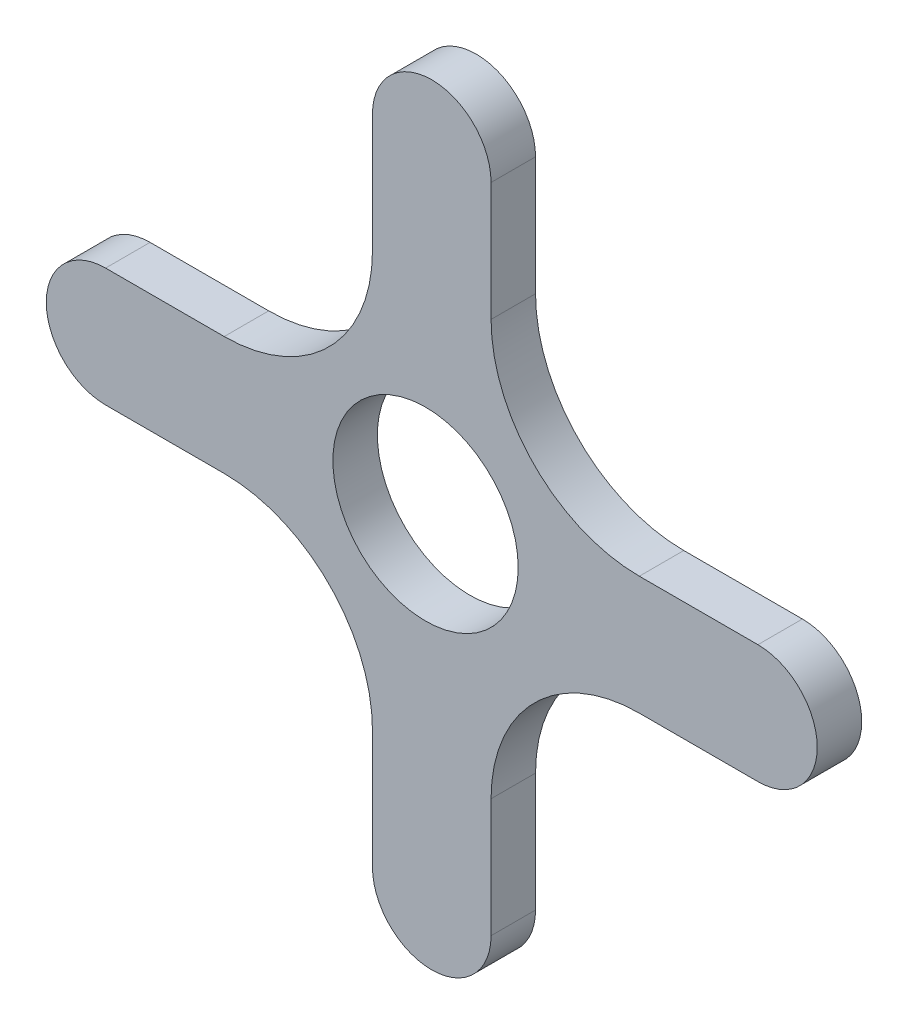
ISO-10303-21;
HEADER;
FILE_DESCRIPTION(('STEP AP214'),'2;1');
FILE_NAME('part.step','',(''),(''),'','','');
FILE_SCHEMA(('AUTOMOTIVE_DESIGN { 1 0 10303 214 1 1 1 1 }'));
ENDSEC;
DATA;
#1=APPLICATION_CONTEXT('core data for automotive mechanical design processes');
#2=APPLICATION_PROTOCOL_DEFINITION('international standard','automotive_design',2000,#1);
#3=PRODUCT_CONTEXT('',#1,'mechanical');
#4=PRODUCT('Part','Part','',(#3));
#5=PRODUCT_RELATED_PRODUCT_CATEGORY('part','',(#4));
#6=PRODUCT_DEFINITION_FORMATION('','',#4);
#7=PRODUCT_DEFINITION_CONTEXT('part definition',#1,'design');
#8=PRODUCT_DEFINITION('design','',#6,#7);
#9=PRODUCT_DEFINITION_SHAPE('','',#8);
#10=(LENGTH_UNIT() NAMED_UNIT(*) SI_UNIT(.MILLI.,.METRE.));
#11=(NAMED_UNIT(*) PLANE_ANGLE_UNIT() SI_UNIT($,.RADIAN.));
#12=(NAMED_UNIT(*) SI_UNIT($,.STERADIAN.) SOLID_ANGLE_UNIT());
#13=UNCERTAINTY_MEASURE_WITH_UNIT(LENGTH_MEASURE(1.E-05),#10,'distance_accuracy_value','');
#14=(GEOMETRIC_REPRESENTATION_CONTEXT(3) GLOBAL_UNCERTAINTY_ASSIGNED_CONTEXT((#13)) GLOBAL_UNIT_ASSIGNED_CONTEXT((#10,
#11,#12)) REPRESENTATION_CONTEXT('',''));
#15=CARTESIAN_POINT('',(0.,0.,0.));
#16=DIRECTION('',(0.,0.,1.));
#17=DIRECTION('',(1.,0.,0.));
#18=AXIS2_PLACEMENT_3D('',#15,#16,#17);
#19=CARTESIAN_POINT('',(-3.58058261758408,0.,3.));
#20=DIRECTION('',(-1.,0.,0.));
#21=DIRECTION('',(0.,-1.,0.));
#22=AXIS2_PLACEMENT_3D('',#19,#20,#21);
#23=PLANE('',#22);
#24=DIRECTION('',(0.,1.,0.));
#25=VECTOR('',#24,1.);
#26=CARTESIAN_POINT('',(-3.58058261758408,0.,0.));
#27=LINE('',#26,#25);
#28=CARTESIAN_POINT('',(-3.58058261758408,-22.4194173824159,0.));
#29=VERTEX_POINT('',#28);
#30=CARTESIAN_POINT('',(-3.58058261758408,-14.4194173824159,0.));
#31=VERTEX_POINT('',#30);
#32=EDGE_CURVE('E219',#29,#31,#27,.T.);
#33=ORIENTED_EDGE('',*,*,#32,.F.);
#34=DIRECTION('',(0.,0.,-1.));
#35=VECTOR('',#34,1.);
#36=CARTESIAN_POINT('',(-3.58058261758408,-22.4194173824159,3.));
#37=LINE('',#36,#35);
#38=CARTESIAN_POINT('',(-3.58058261758408,-22.4194173824159,3.));
#39=VERTEX_POINT('',#38);
#40=EDGE_CURVE('E11',#39,#29,#37,.T.);
#41=ORIENTED_EDGE('',*,*,#40,.F.);
#42=DIRECTION('',(0.,1.,0.));
#43=VECTOR('',#42,1.);
#44=CARTESIAN_POINT('',(-3.58058261758408,0.,3.));
#45=LINE('',#44,#43);
#46=CARTESIAN_POINT('',(-3.58058261758408,-14.4194173824159,3.));
#47=VERTEX_POINT('',#46);
#48=EDGE_CURVE('E334',#39,#47,#45,.T.);
#49=ORIENTED_EDGE('',*,*,#48,.T.);
#50=DIRECTION('',(0.,0.,-1.));
#51=VECTOR('',#50,1.);
#52=CARTESIAN_POINT('',(-3.58058261758408,-14.4194173824159,3.));
#53=LINE('',#52,#51);
#54=EDGE_CURVE('E110',#47,#31,#53,.T.);
#55=ORIENTED_EDGE('',*,*,#54,.T.);
#56=EDGE_LOOP('',(#33,#41,#49,#55));
#57=FACE_BOUND('',#56,.T.);
#58=ADVANCED_FACE('F35',(#57),#23,.T.);
#59=CARTESIAN_POINT('',(0.419417382415922,-22.4194173824159,3.));
#60=DIRECTION('',(0.,0.,-1.));
#61=DIRECTION('',(-1.,0.,0.));
#62=AXIS2_PLACEMENT_3D('',#59,#60,#61);
#63=CYLINDRICAL_SURFACE('',#62,4.);
#64=CARTESIAN_POINT('',(0.419417382415922,-22.4194173824159,0.));
#65=DIRECTION('',(0.,0.,1.));
#66=DIRECTION('',(1.,0.,0.));
#67=AXIS2_PLACEMENT_3D('',#64,#65,#66);
#68=CIRCLE('',#67,4.);
#69=CARTESIAN_POINT('',(4.41941738241592,-22.4194173824159,0.));
#70=VERTEX_POINT('',#69);
#71=EDGE_CURVE('E217',#29,#70,#68,.T.);
#72=ORIENTED_EDGE('',*,*,#71,.T.);
#73=DIRECTION('',(0.,0.,-1.));
#74=VECTOR('',#73,1.);
#75=CARTESIAN_POINT('',(4.41941738241592,-22.4194173824159,3.));
#76=LINE('',#75,#74);
#77=CARTESIAN_POINT('',(4.41941738241592,-22.4194173824159,3.));
#78=VERTEX_POINT('',#77);
#79=EDGE_CURVE('E44',#78,#70,#76,.T.);
#80=ORIENTED_EDGE('',*,*,#79,.F.);
#81=CARTESIAN_POINT('',(0.419417382415922,-22.4194173824159,3.));
#82=DIRECTION('',(0.,0.,1.));
#83=DIRECTION('',(1.,0.,0.));
#84=AXIS2_PLACEMENT_3D('',#81,#82,#83);
#85=CIRCLE('',#84,4.);
#86=EDGE_CURVE('E336',#39,#78,#85,.T.);
#87=ORIENTED_EDGE('',*,*,#86,.F.);
#88=ORIENTED_EDGE('',*,*,#40,.T.);
#89=EDGE_LOOP('',(#72,#80,#87,#88));
#90=FACE_BOUND('',#89,.T.);
#91=ADVANCED_FACE('F218',(#90),#63,.T.);
#92=CARTESIAN_POINT('',(4.41941738241592,0.,3.));
#93=DIRECTION('',(-1.,0.,0.));
#94=DIRECTION('',(0.,0.,1.));
#95=AXIS2_PLACEMENT_3D('',#92,#93,#94);
#96=PLANE('',#95);
#97=DIRECTION('',(0.,1.,0.));
#98=VECTOR('',#97,1.);
#99=CARTESIAN_POINT('',(4.41941738241592,0.,0.));
#100=LINE('',#99,#98);
#101=CARTESIAN_POINT('',(4.41941738241592,-14.4194173824159,0.));
#102=VERTEX_POINT('',#101);
#103=EDGE_CURVE('E211',#70,#102,#100,.T.);
#104=ORIENTED_EDGE('',*,*,#103,.T.);
#105=DIRECTION('',(0.,0.,-1.));
#106=VECTOR('',#105,1.);
#107=CARTESIAN_POINT('',(4.41941738241592,-14.4194173824159,3.));
#108=LINE('',#107,#106);
#109=CARTESIAN_POINT('',(4.41941738241592,-14.4194173824159,3.));
#110=VERTEX_POINT('',#109);
#111=EDGE_CURVE('E202',#110,#102,#108,.T.);
#112=ORIENTED_EDGE('',*,*,#111,.F.);
#113=DIRECTION('',(0.,1.,0.));
#114=VECTOR('',#113,1.);
#115=CARTESIAN_POINT('',(4.41941738241592,0.,3.));
#116=LINE('',#115,#114);
#117=EDGE_CURVE('E213',#78,#110,#116,.T.);
#118=ORIENTED_EDGE('',*,*,#117,.F.);
#119=ORIENTED_EDGE('',*,*,#79,.T.);
#120=EDGE_LOOP('',(#104,#112,#118,#119));
#121=FACE_BOUND('',#120,.T.);
#122=ADVANCED_FACE('F209',(#121),#96,.F.);
#123=CARTESIAN_POINT('',(14.4194173824159,-14.4194173824159,3.));
#124=DIRECTION('',(0.,0.,-1.));
#125=DIRECTION('',(-1.,0.,0.));
#126=AXIS2_PLACEMENT_3D('',#123,#124,#125);
#127=CYLINDRICAL_SURFACE('',#126,10.);
#128=CARTESIAN_POINT('',(14.4194173824159,-14.4194173824159,0.));
#129=DIRECTION('',(0.,0.,1.));
#130=DIRECTION('',(1.,0.,0.));
#131=AXIS2_PLACEMENT_3D('',#128,#129,#130);
#132=CIRCLE('',#131,10.);
#133=CARTESIAN_POINT('',(14.4194173824159,-4.41941738241592,0.));
#134=VERTEX_POINT('',#133);
#135=EDGE_CURVE('E221',#102,#134,#132,.F.);
#136=ORIENTED_EDGE('',*,*,#135,.T.);
#137=DIRECTION('',(0.,0.,-1.));
#138=VECTOR('',#137,1.);
#139=CARTESIAN_POINT('',(14.4194173824159,-4.41941738241592,3.));
#140=LINE('',#139,#138);
#141=CARTESIAN_POINT('',(14.4194173824159,-4.41941738241592,3.));
#142=VERTEX_POINT('',#141);
#143=EDGE_CURVE('E199',#142,#134,#140,.T.);
#144=ORIENTED_EDGE('',*,*,#143,.F.);
#145=CARTESIAN_POINT('',(14.4194173824159,-14.4194173824159,3.));
#146=DIRECTION('',(0.,0.,1.));
#147=DIRECTION('',(1.,0.,0.));
#148=AXIS2_PLACEMENT_3D('',#145,#146,#147);
#149=CIRCLE('',#148,10.);
#150=EDGE_CURVE('E341',#110,#142,#149,.F.);
#151=ORIENTED_EDGE('',*,*,#150,.F.);
#152=ORIENTED_EDGE('',*,*,#111,.T.);
#153=EDGE_LOOP('',(#136,#144,#151,#152));
#154=FACE_BOUND('',#153,.T.);
#155=ADVANCED_FACE('F285',(#154),#127,.F.);
#156=CARTESIAN_POINT('',(0.,-4.41941738241592,3.));
#157=DIRECTION('',(0.,1.,0.));
#158=DIRECTION('',(0.,0.,1.));
#159=AXIS2_PLACEMENT_3D('',#156,#157,#158);
#160=PLANE('',#159);
#161=DIRECTION('',(1.,0.,0.));
#162=VECTOR('',#161,1.);
#163=CARTESIAN_POINT('',(0.,-4.41941738241592,0.));
#164=LINE('',#163,#162);
#165=CARTESIAN_POINT('',(22.4194173824159,-4.41941738241592,0.));
#166=VERTEX_POINT('',#165);
#167=EDGE_CURVE('E229',#134,#166,#164,.T.);
#168=ORIENTED_EDGE('',*,*,#167,.T.);
#169=DIRECTION('',(0.,0.,-1.));
#170=VECTOR('',#169,1.);
#171=CARTESIAN_POINT('',(22.4194173824159,-4.41941738241592,3.));
#172=LINE('',#171,#170);
#173=CARTESIAN_POINT('',(22.4194173824159,-4.41941738241592,3.));
#174=VERTEX_POINT('',#173);
#175=EDGE_CURVE('E196',#174,#166,#172,.T.);
#176=ORIENTED_EDGE('',*,*,#175,.F.);
#177=DIRECTION('',(1.,0.,0.));
#178=VECTOR('',#177,1.);
#179=CARTESIAN_POINT('',(0.,-4.41941738241592,3.));
#180=LINE('',#179,#178);
#181=EDGE_CURVE('E344',#142,#174,#180,.T.);
#182=ORIENTED_EDGE('',*,*,#181,.F.);
#183=ORIENTED_EDGE('',*,*,#143,.T.);
#184=EDGE_LOOP('',(#168,#176,#182,#183));
#185=FACE_BOUND('',#184,.T.);
#186=ADVANCED_FACE('F288',(#185),#160,.F.);
#187=CARTESIAN_POINT('',(22.4194173824159,-0.419417382415922,3.));
#188=DIRECTION('',(0.,0.,-1.));
#189=DIRECTION('',(-1.,0.,0.));
#190=AXIS2_PLACEMENT_3D('',#187,#188,#189);
#191=CYLINDRICAL_SURFACE('',#190,4.);
#192=CARTESIAN_POINT('',(22.4194173824159,-0.419417382415922,0.));
#193=DIRECTION('',(0.,0.,1.));
#194=DIRECTION('',(1.,0.,0.));
#195=AXIS2_PLACEMENT_3D('',#192,#193,#194);
#196=CIRCLE('',#195,4.);
#197=CARTESIAN_POINT('',(22.4194173824159,3.58058261758408,0.));
#198=VERTEX_POINT('',#197);
#199=EDGE_CURVE('E232',#166,#198,#196,.T.);
#200=ORIENTED_EDGE('',*,*,#199,.T.);
#201=DIRECTION('',(0.,0.,-1.));
#202=VECTOR('',#201,1.);
#203=CARTESIAN_POINT('',(22.4194173824159,3.58058261758408,3.));
#204=LINE('',#203,#202);
#205=CARTESIAN_POINT('',(22.4194173824159,3.58058261758408,3.));
#206=VERTEX_POINT('',#205);
#207=EDGE_CURVE('E194',#206,#198,#204,.T.);
#208=ORIENTED_EDGE('',*,*,#207,.F.);
#209=CARTESIAN_POINT('',(22.4194173824159,-0.419417382415922,3.));
#210=DIRECTION('',(0.,0.,1.));
#211=DIRECTION('',(1.,0.,0.));
#212=AXIS2_PLACEMENT_3D('',#209,#210,#211);
#213=CIRCLE('',#212,4.);
#214=EDGE_CURVE('E347',#174,#206,#213,.T.);
#215=ORIENTED_EDGE('',*,*,#214,.F.);
#216=ORIENTED_EDGE('',*,*,#175,.T.);
#217=EDGE_LOOP('',(#200,#208,#215,#216));
#218=FACE_BOUND('',#217,.T.);
#219=ADVANCED_FACE('F292',(#218),#191,.T.);
#220=CARTESIAN_POINT('',(0.,3.58058261758408,3.));
#221=DIRECTION('',(0.,1.,0.));
#222=DIRECTION('',(0.,0.,1.));
#223=AXIS2_PLACEMENT_3D('',#220,#221,#222);
#224=PLANE('',#223);
#225=DIRECTION('',(1.,0.,0.));
#226=VECTOR('',#225,1.);
#227=CARTESIAN_POINT('',(0.,3.58058261758408,0.));
#228=LINE('',#227,#226);
#229=CARTESIAN_POINT('',(14.4194173824159,3.58058261758408,0.));
#230=VERTEX_POINT('',#229);
#231=EDGE_CURVE('E235',#230,#198,#228,.T.);
#232=ORIENTED_EDGE('',*,*,#231,.F.);
#233=DIRECTION('',(0.,0.,-1.));
#234=VECTOR('',#233,1.);
#235=CARTESIAN_POINT('',(14.4194173824159,3.58058261758408,3.));
#236=LINE('',#235,#234);
#237=CARTESIAN_POINT('',(14.4194173824159,3.58058261758408,3.));
#238=VERTEX_POINT('',#237);
#239=EDGE_CURVE('E192',#238,#230,#236,.T.);
#240=ORIENTED_EDGE('',*,*,#239,.F.);
#241=DIRECTION('',(1.,0.,0.));
#242=VECTOR('',#241,1.);
#243=CARTESIAN_POINT('',(0.,3.58058261758408,3.));
#244=LINE('',#243,#242);
#245=EDGE_CURVE('E349',#238,#206,#244,.T.);
#246=ORIENTED_EDGE('',*,*,#245,.T.);
#247=ORIENTED_EDGE('',*,*,#207,.T.);
#248=EDGE_LOOP('',(#232,#240,#246,#247));
#249=FACE_BOUND('',#248,.T.);
#250=ADVANCED_FACE('F296',(#249),#224,.T.);
#251=CARTESIAN_POINT('',(14.4194173824159,13.5805826175841,3.));
#252=DIRECTION('',(0.,0.,-1.));
#253=DIRECTION('',(-1.,0.,0.));
#254=AXIS2_PLACEMENT_3D('',#251,#252,#253);
#255=CYLINDRICAL_SURFACE('',#254,10.);
#256=CARTESIAN_POINT('',(14.4194173824159,13.5805826175841,0.));
#257=DIRECTION('',(0.,0.,1.));
#258=DIRECTION('',(1.,0.,0.));
#259=AXIS2_PLACEMENT_3D('',#256,#257,#258);
#260=CIRCLE('',#259,10.);
#261=CARTESIAN_POINT('',(4.41941738241592,13.5805826175841,0.));
#262=VERTEX_POINT('',#261);
#263=EDGE_CURVE('E238',#230,#262,#260,.F.);
#264=ORIENTED_EDGE('',*,*,#263,.T.);
#265=DIRECTION('',(0.,0.,-1.));
#266=VECTOR('',#265,1.);
#267=CARTESIAN_POINT('',(4.41941738241592,13.5805826175841,3.));
#268=LINE('',#267,#266);
#269=CARTESIAN_POINT('',(4.41941738241592,13.5805826175841,3.));
#270=VERTEX_POINT('',#269);
#271=EDGE_CURVE('E189',#270,#262,#268,.T.);
#272=ORIENTED_EDGE('',*,*,#271,.F.);
#273=CARTESIAN_POINT('',(14.4194173824159,13.5805826175841,3.));
#274=DIRECTION('',(0.,0.,1.));
#275=DIRECTION('',(1.,0.,0.));
#276=AXIS2_PLACEMENT_3D('',#273,#274,#275);
#277=CIRCLE('',#276,10.);
#278=EDGE_CURVE('E352',#238,#270,#277,.F.);
#279=ORIENTED_EDGE('',*,*,#278,.F.);
#280=ORIENTED_EDGE('',*,*,#239,.T.);
#281=EDGE_LOOP('',(#264,#272,#279,#280));
#282=FACE_BOUND('',#281,.T.);
#283=ADVANCED_FACE('F300',(#282),#255,.F.);
#284=CARTESIAN_POINT('',(4.41941738241593,0.,3.));
#285=DIRECTION('',(-1.,0.,0.));
#286=DIRECTION('',(0.,-1.,0.));
#287=AXIS2_PLACEMENT_3D('',#284,#285,#286);
#288=PLANE('',#287);
#289=DIRECTION('',(0.,1.,0.));
#290=VECTOR('',#289,1.);
#291=CARTESIAN_POINT('',(4.41941738241593,0.,0.));
#292=LINE('',#291,#290);
#293=CARTESIAN_POINT('',(4.41941738241592,21.580582617584,0.));
#294=VERTEX_POINT('',#293);
#295=EDGE_CURVE('E241',#262,#294,#292,.T.);
#296=ORIENTED_EDGE('',*,*,#295,.T.);
#297=DIRECTION('',(0.,0.,-1.));
#298=VECTOR('',#297,1.);
#299=CARTESIAN_POINT('',(4.41941738241592,21.580582617584,3.));
#300=LINE('',#299,#298);
#301=CARTESIAN_POINT('',(4.41941738241592,21.580582617584,3.));
#302=VERTEX_POINT('',#301);
#303=EDGE_CURVE('E186',#302,#294,#300,.T.);
#304=ORIENTED_EDGE('',*,*,#303,.F.);
#305=DIRECTION('',(0.,1.,0.));
#306=VECTOR('',#305,1.);
#307=CARTESIAN_POINT('',(4.41941738241593,0.,3.));
#308=LINE('',#307,#306);
#309=EDGE_CURVE('E355',#270,#302,#308,.T.);
#310=ORIENTED_EDGE('',*,*,#309,.F.);
#311=ORIENTED_EDGE('',*,*,#271,.T.);
#312=EDGE_LOOP('',(#296,#304,#310,#311));
#313=FACE_BOUND('',#312,.T.);
#314=ADVANCED_FACE('F304',(#313),#288,.F.);
#315=CARTESIAN_POINT('',(0.419417382415922,21.580582617584,3.));
#316=DIRECTION('',(0.,0.,-1.));
#317=DIRECTION('',(-1.,0.,0.));
#318=AXIS2_PLACEMENT_3D('',#315,#316,#317);
#319=CYLINDRICAL_SURFACE('',#318,4.);
#320=CARTESIAN_POINT('',(0.419417382415922,21.580582617584,0.));
#321=DIRECTION('',(0.,0.,1.));
#322=DIRECTION('',(1.,0.,0.));
#323=AXIS2_PLACEMENT_3D('',#320,#321,#322);
#324=CIRCLE('',#323,4.);
#325=CARTESIAN_POINT('',(-3.58058261758408,21.580582617584,0.));
#326=VERTEX_POINT('',#325);
#327=EDGE_CURVE('E244',#294,#326,#324,.T.);
#328=ORIENTED_EDGE('',*,*,#327,.T.);
#329=DIRECTION('',(0.,0.,-1.));
#330=VECTOR('',#329,1.);
#331=CARTESIAN_POINT('',(-3.58058261758408,21.580582617584,3.));
#332=LINE('',#331,#330);
#333=CARTESIAN_POINT('',(-3.58058261758408,21.580582617584,3.));
#334=VERTEX_POINT('',#333);
#335=EDGE_CURVE('E184',#334,#326,#332,.T.);
#336=ORIENTED_EDGE('',*,*,#335,.F.);
#337=CARTESIAN_POINT('',(0.419417382415922,21.580582617584,3.));
#338=DIRECTION('',(0.,0.,1.));
#339=DIRECTION('',(1.,0.,0.));
#340=AXIS2_PLACEMENT_3D('',#337,#338,#339);
#341=CIRCLE('',#340,4.);
#342=EDGE_CURVE('E358',#302,#334,#341,.T.);
#343=ORIENTED_EDGE('',*,*,#342,.F.);
#344=ORIENTED_EDGE('',*,*,#303,.T.);
#345=EDGE_LOOP('',(#328,#336,#343,#344));
#346=FACE_BOUND('',#345,.T.);
#347=ADVANCED_FACE('F308',(#346),#319,.T.);
#348=CARTESIAN_POINT('',(-3.58058261758408,0.,3.));
#349=DIRECTION('',(-1.,0.,0.));
#350=DIRECTION('',(0.,-1.,0.));
#351=AXIS2_PLACEMENT_3D('',#348,#349,#350);
#352=PLANE('',#351);
#353=DIRECTION('',(0.,1.,0.));
#354=VECTOR('',#353,1.);
#355=CARTESIAN_POINT('',(-3.58058261758408,0.,0.));
#356=LINE('',#355,#354);
#357=CARTESIAN_POINT('',(-3.58058261758408,13.5805826175841,0.));
#358=VERTEX_POINT('',#357);
#359=EDGE_CURVE('E247',#358,#326,#356,.T.);
#360=ORIENTED_EDGE('',*,*,#359,.F.);
#361=DIRECTION('',(0.,0.,-1.));
#362=VECTOR('',#361,1.);
#363=CARTESIAN_POINT('',(-3.58058261758408,13.5805826175841,3.));
#364=LINE('',#363,#362);
#365=CARTESIAN_POINT('',(-3.58058261758408,13.5805826175841,3.));
#366=VERTEX_POINT('',#365);
#367=EDGE_CURVE('E182',#366,#358,#364,.T.);
#368=ORIENTED_EDGE('',*,*,#367,.F.);
#369=DIRECTION('',(0.,1.,0.));
#370=VECTOR('',#369,1.);
#371=CARTESIAN_POINT('',(-3.58058261758408,0.,3.));
#372=LINE('',#371,#370);
#373=EDGE_CURVE('E360',#366,#334,#372,.T.);
#374=ORIENTED_EDGE('',*,*,#373,.T.);
#375=ORIENTED_EDGE('',*,*,#335,.T.);
#376=EDGE_LOOP('',(#360,#368,#374,#375));
#377=FACE_BOUND('',#376,.T.);
#378=ADVANCED_FACE('F312',(#377),#352,.T.);
#379=CARTESIAN_POINT('',(-13.5805826175841,13.5805826175841,3.));
#380=DIRECTION('',(0.,0.,-1.));
#381=DIRECTION('',(-1.,0.,0.));
#382=AXIS2_PLACEMENT_3D('',#379,#380,#381);
#383=CYLINDRICAL_SURFACE('',#382,10.);
#384=CARTESIAN_POINT('',(-13.5805826175841,13.5805826175841,0.));
#385=DIRECTION('',(0.,0.,1.));
#386=DIRECTION('',(1.,0.,0.));
#387=AXIS2_PLACEMENT_3D('',#384,#385,#386);
#388=CIRCLE('',#387,10.);
#389=CARTESIAN_POINT('',(-13.5805826175841,3.58058261758408,0.));
#390=VERTEX_POINT('',#389);
#391=EDGE_CURVE('E250',#358,#390,#388,.F.);
#392=ORIENTED_EDGE('',*,*,#391,.T.);
#393=DIRECTION('',(0.,0.,-1.));
#394=VECTOR('',#393,1.);
#395=CARTESIAN_POINT('',(-13.5805826175841,3.58058261758408,3.));
#396=LINE('',#395,#394);
#397=CARTESIAN_POINT('',(-13.5805826175841,3.58058261758408,3.));
#398=VERTEX_POINT('',#397);
#399=EDGE_CURVE('E176',#398,#390,#396,.T.);
#400=ORIENTED_EDGE('',*,*,#399,.F.);
#401=CARTESIAN_POINT('',(-13.5805826175841,13.5805826175841,3.));
#402=DIRECTION('',(0.,0.,1.));
#403=DIRECTION('',(1.,0.,0.));
#404=AXIS2_PLACEMENT_3D('',#401,#402,#403);
#405=CIRCLE('',#404,10.);
#406=EDGE_CURVE('E363',#366,#398,#405,.F.);
#407=ORIENTED_EDGE('',*,*,#406,.F.);
#408=ORIENTED_EDGE('',*,*,#367,.T.);
#409=EDGE_LOOP('',(#392,#400,#407,#408));
#410=FACE_BOUND('',#409,.T.);
#411=ADVANCED_FACE('F316',(#410),#383,.F.);
#412=CARTESIAN_POINT('',(0.,3.58058261758408,3.));
#413=DIRECTION('',(0.,1.,0.));
#414=DIRECTION('',(0.,0.,1.));
#415=AXIS2_PLACEMENT_3D('',#412,#413,#414);
#416=PLANE('',#415);
#417=DIRECTION('',(1.,0.,0.));
#418=VECTOR('',#417,1.);
#419=CARTESIAN_POINT('',(0.,3.58058261758408,0.));
#420=LINE('',#419,#418);
#421=CARTESIAN_POINT('',(-21.5805826175841,3.58058261758408,0.));
#422=VERTEX_POINT('',#421);
#423=EDGE_CURVE('E253',#422,#390,#420,.T.);
#424=ORIENTED_EDGE('',*,*,#423,.F.);
#425=DIRECTION('',(0.,0.,-1.));
#426=VECTOR('',#425,1.);
#427=CARTESIAN_POINT('',(-21.5805826175841,3.58058261758408,3.));
#428=LINE('',#427,#426);
#429=CARTESIAN_POINT('',(-21.5805826175841,3.58058261758408,3.));
#430=VERTEX_POINT('',#429);
#431=EDGE_CURVE('E174',#430,#422,#428,.T.);
#432=ORIENTED_EDGE('',*,*,#431,.F.);
#433=DIRECTION('',(1.,0.,0.));
#434=VECTOR('',#433,1.);
#435=CARTESIAN_POINT('',(0.,3.58058261758408,3.));
#436=LINE('',#435,#434);
#437=EDGE_CURVE('E168',#430,#398,#436,.T.);
#438=ORIENTED_EDGE('',*,*,#437,.T.);
#439=ORIENTED_EDGE('',*,*,#399,.T.);
#440=EDGE_LOOP('',(#424,#432,#438,#439));
#441=FACE_BOUND('',#440,.T.);
#442=ADVANCED_FACE('F320',(#441),#416,.T.);
#443=CARTESIAN_POINT('',(-21.5805826175841,-0.419417382415922,3.));
#444=DIRECTION('',(0.,0.,-1.));
#445=DIRECTION('',(-1.,0.,0.));
#446=AXIS2_PLACEMENT_3D('',#443,#444,#445);
#447=CYLINDRICAL_SURFACE('',#446,4.);
#448=CARTESIAN_POINT('',(-21.5805826175841,-0.419417382415922,0.));
#449=DIRECTION('',(0.,0.,1.));
#450=DIRECTION('',(1.,0.,0.));
#451=AXIS2_PLACEMENT_3D('',#448,#449,#450);
#452=CIRCLE('',#451,4.);
#453=CARTESIAN_POINT('',(-21.5805826175841,-4.41941738241592,0.));
#454=VERTEX_POINT('',#453);
#455=EDGE_CURVE('E173',#422,#454,#452,.T.);
#456=ORIENTED_EDGE('',*,*,#455,.T.);
#457=DIRECTION('',(0.,0.,-1.));
#458=VECTOR('',#457,1.);
#459=CARTESIAN_POINT('',(-21.5805826175841,-4.41941738241592,3.));
#460=LINE('',#459,#458);
#461=CARTESIAN_POINT('',(-21.5805826175841,-4.41941738241592,3.));
#462=VERTEX_POINT('',#461);
#463=EDGE_CURVE('E159',#462,#454,#460,.T.);
#464=ORIENTED_EDGE('',*,*,#463,.F.);
#465=CARTESIAN_POINT('',(-21.5805826175841,-0.419417382415922,3.));
#466=DIRECTION('',(0.,0.,1.));
#467=DIRECTION('',(1.,0.,0.));
#468=AXIS2_PLACEMENT_3D('',#465,#466,#467);
#469=CIRCLE('',#468,4.);
#470=EDGE_CURVE('E162',#430,#462,#469,.T.);
#471=ORIENTED_EDGE('',*,*,#470,.F.);
#472=ORIENTED_EDGE('',*,*,#431,.T.);
#473=EDGE_LOOP('',(#456,#464,#471,#472));
#474=FACE_BOUND('',#473,.T.);
#475=ADVANCED_FACE('F171',(#474),#447,.T.);
#476=CARTESIAN_POINT('',(0.,-4.41941738241592,3.));
#477=DIRECTION('',(0.,1.,0.));
#478=DIRECTION('',(-1.,0.,0.));
#479=AXIS2_PLACEMENT_3D('',#476,#477,#478);
#480=PLANE('',#479);
#481=DIRECTION('',(1.,0.,0.));
#482=VECTOR('',#481,1.);
#483=CARTESIAN_POINT('',(0.,-4.41941738241592,0.));
#484=LINE('',#483,#482);
#485=CARTESIAN_POINT('',(-13.5805826175841,-4.41941738241592,0.));
#486=VERTEX_POINT('',#485);
#487=EDGE_CURVE('E257',#454,#486,#484,.T.);
#488=ORIENTED_EDGE('',*,*,#487,.T.);
#489=DIRECTION('',(0.,0.,-1.));
#490=VECTOR('',#489,1.);
#491=CARTESIAN_POINT('',(-13.5805826175841,-4.41941738241592,3.));
#492=LINE('',#491,#490);
#493=CARTESIAN_POINT('',(-13.5805826175841,-4.41941738241592,3.));
#494=VERTEX_POINT('',#493);
#495=EDGE_CURVE('E161',#494,#486,#492,.T.);
#496=ORIENTED_EDGE('',*,*,#495,.F.);
#497=DIRECTION('',(1.,0.,0.));
#498=VECTOR('',#497,1.);
#499=CARTESIAN_POINT('',(0.,-4.41941738241592,3.));
#500=LINE('',#499,#498);
#501=EDGE_CURVE('E154',#462,#494,#500,.T.);
#502=ORIENTED_EDGE('',*,*,#501,.F.);
#503=ORIENTED_EDGE('',*,*,#463,.T.);
#504=EDGE_LOOP('',(#488,#496,#502,#503));
#505=FACE_BOUND('',#504,.T.);
#506=ADVANCED_FACE('F157',(#505),#480,.F.);
#507=CARTESIAN_POINT('',(0.,0.,3.));
#508=DIRECTION('',(0.,0.,-1.));
#509=DIRECTION('',(-1.,0.,0.));
#510=AXIS2_PLACEMENT_3D('',#507,#508,#509);
#511=CYLINDRICAL_SURFACE('',#510,6.25);
#512=CARTESIAN_POINT('',(0.,0.,3.));
#513=DIRECTION('',(0.,0.,1.));
#514=DIRECTION('',(1.,0.,0.));
#515=AXIS2_PLACEMENT_3D('',#512,#513,#514);
#516=CIRCLE('',#515,6.25);
#517=CARTESIAN_POINT('',(6.25,0.,3.));
#518=VERTEX_POINT('',#517);
#519=EDGE_CURVE('E259',#518,#518,#516,.T.);
#520=ORIENTED_EDGE('',*,*,#519,.T.);
#521=EDGE_LOOP('',(#520));
#522=FACE_BOUND('',#521,.T.);
#523=CARTESIAN_POINT('',(0.,0.,0.));
#524=DIRECTION('',(0.,0.,1.));
#525=DIRECTION('',(1.,0.,0.));
#526=AXIS2_PLACEMENT_3D('',#523,#524,#525);
#527=CIRCLE('',#526,6.25);
#528=CARTESIAN_POINT('',(6.25,0.,0.));
#529=VERTEX_POINT('',#528);
#530=EDGE_CURVE('E223',#529,#529,#527,.T.);
#531=ORIENTED_EDGE('',*,*,#530,.F.);
#532=EDGE_LOOP('',(#531));
#533=FACE_BOUND('',#532,.T.);
#534=ADVANCED_FACE('F37',(#522,#533),#511,.F.);
#535=CARTESIAN_POINT('',(-13.5805826175841,-14.4194173824159,3.));
#536=DIRECTION('',(0.,0.,-1.));
#537=DIRECTION('',(-1.,0.,0.));
#538=AXIS2_PLACEMENT_3D('',#535,#536,#537);
#539=CYLINDRICAL_SURFACE('',#538,10.);
#540=CARTESIAN_POINT('',(-13.5805826175841,-14.4194173824159,0.));
#541=DIRECTION('',(0.,0.,1.));
#542=DIRECTION('',(1.,0.,0.));
#543=AXIS2_PLACEMENT_3D('',#540,#541,#542);
#544=CIRCLE('',#543,10.);
#545=EDGE_CURVE('E103',#486,#31,#544,.F.);
#546=ORIENTED_EDGE('',*,*,#545,.T.);
#547=ORIENTED_EDGE('',*,*,#54,.F.);
#548=CARTESIAN_POINT('',(-13.5805826175841,-14.4194173824159,3.));
#549=DIRECTION('',(0.,0.,1.));
#550=DIRECTION('',(1.,0.,0.));
#551=AXIS2_PLACEMENT_3D('',#548,#549,#550);
#552=CIRCLE('',#551,10.);
#553=EDGE_CURVE('E52',#494,#47,#552,.F.);
#554=ORIENTED_EDGE('',*,*,#553,.F.);
#555=ORIENTED_EDGE('',*,*,#495,.T.);
#556=EDGE_LOOP('',(#546,#547,#554,#555));
#557=FACE_BOUND('',#556,.T.);
#558=ADVANCED_FACE('F267',(#557),#539,.F.);
#559=CARTESIAN_POINT('',(0.,0.,3.));
#560=DIRECTION('',(0.,0.,1.));
#561=DIRECTION('',(1.,0.,0.));
#562=AXIS2_PLACEMENT_3D('',#559,#560,#561);
#563=PLANE('',#562);
#564=ORIENTED_EDGE('',*,*,#519,.F.);
#565=EDGE_LOOP('',(#564));
#566=FACE_BOUND('',#565,.T.);
#567=ORIENTED_EDGE('',*,*,#48,.F.);
#568=ORIENTED_EDGE('',*,*,#86,.T.);
#569=ORIENTED_EDGE('',*,*,#117,.T.);
#570=ORIENTED_EDGE('',*,*,#150,.T.);
#571=ORIENTED_EDGE('',*,*,#181,.T.);
#572=ORIENTED_EDGE('',*,*,#214,.T.);
#573=ORIENTED_EDGE('',*,*,#245,.F.);
#574=ORIENTED_EDGE('',*,*,#278,.T.);
#575=ORIENTED_EDGE('',*,*,#309,.T.);
#576=ORIENTED_EDGE('',*,*,#342,.T.);
#577=ORIENTED_EDGE('',*,*,#373,.F.);
#578=ORIENTED_EDGE('',*,*,#406,.T.);
#579=ORIENTED_EDGE('',*,*,#437,.F.);
#580=ORIENTED_EDGE('',*,*,#470,.T.);
#581=ORIENTED_EDGE('',*,*,#501,.T.);
#582=ORIENTED_EDGE('',*,*,#553,.T.);
#583=EDGE_LOOP('',(#567,#568,#569,#570,#571,#572,#573,#574,#575,#576,#577,#578,#579,#580,#581,#582));
#584=FACE_BOUND('',#583,.T.);
#585=ADVANCED_FACE('F166',(#566,#584),#563,.T.);
#586=CARTESIAN_POINT('',(0.,0.,0.));
#587=DIRECTION('',(0.,0.,1.));
#588=DIRECTION('',(1.,0.,0.));
#589=AXIS2_PLACEMENT_3D('',#586,#587,#588);
#590=PLANE('',#589);
#591=ORIENTED_EDGE('',*,*,#530,.T.);
#592=EDGE_LOOP('',(#591));
#593=FACE_BOUND('',#592,.T.);
#594=ORIENTED_EDGE('',*,*,#32,.T.);
#595=ORIENTED_EDGE('',*,*,#545,.F.);
#596=ORIENTED_EDGE('',*,*,#487,.F.);
#597=ORIENTED_EDGE('',*,*,#455,.F.);
#598=ORIENTED_EDGE('',*,*,#423,.T.);
#599=ORIENTED_EDGE('',*,*,#391,.F.);
#600=ORIENTED_EDGE('',*,*,#359,.T.);
#601=ORIENTED_EDGE('',*,*,#327,.F.);
#602=ORIENTED_EDGE('',*,*,#295,.F.);
#603=ORIENTED_EDGE('',*,*,#263,.F.);
#604=ORIENTED_EDGE('',*,*,#231,.T.);
#605=ORIENTED_EDGE('',*,*,#199,.F.);
#606=ORIENTED_EDGE('',*,*,#167,.F.);
#607=ORIENTED_EDGE('',*,*,#135,.F.);
#608=ORIENTED_EDGE('',*,*,#103,.F.);
#609=ORIENTED_EDGE('',*,*,#71,.F.);
#610=EDGE_LOOP('',(#594,#595,#596,#597,#598,#599,#600,#601,#602,#603,#604,#605,#606,#607,#608,#609));
#611=FACE_BOUND('',#610,.T.);
#612=ADVANCED_FACE('F264',(#593,#611),#590,.F.);
#613=CLOSED_SHELL('',(#58,#91,#122,#155,#186,#219,#250,#283,#314,#347,#378,#411,#442,#475,#506,
#534,#558,#585,#612));
#614=MANIFOLD_SOLID_BREP('B2',#613);
#615=ADVANCED_BREP_SHAPE_REPRESENTATION('',(#18,#614),#14);
#616=SHAPE_DEFINITION_REPRESENTATION(#9,#615);
ENDSEC;
END-ISO-10303-21;
